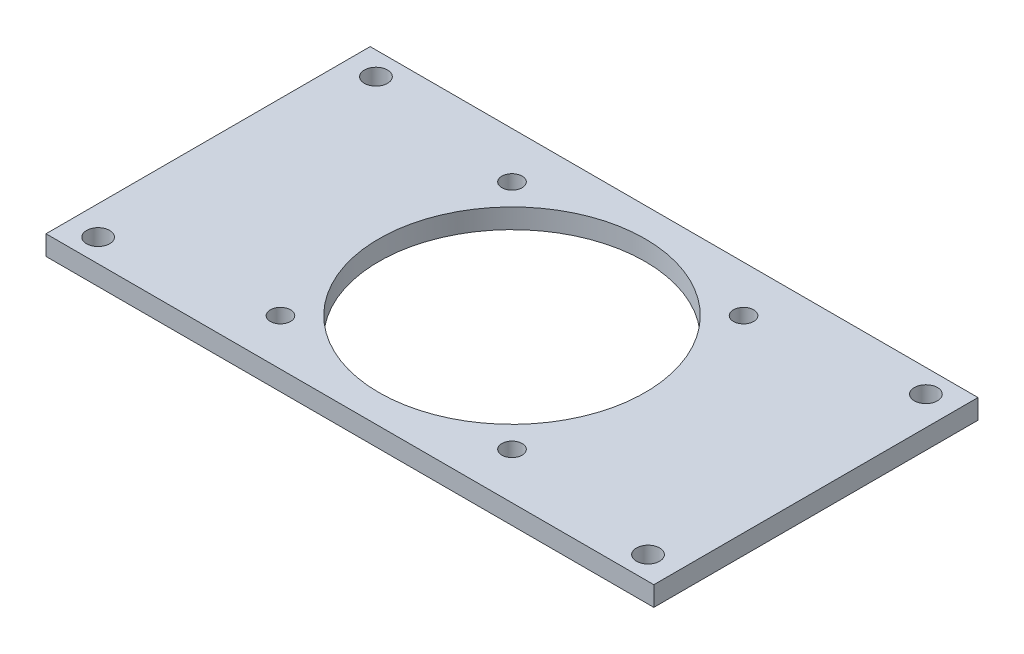
ISO-10303-21;
HEADER;
FILE_DESCRIPTION(('STEP AP214'),'2;1');
FILE_NAME('part.step','',(''),(''),'','','');
FILE_SCHEMA(('AUTOMOTIVE_DESIGN { 1 0 10303 214 1 1 1 1 }'));
ENDSEC;
DATA;
#1=APPLICATION_CONTEXT('core data for automotive mechanical design processes');
#2=APPLICATION_PROTOCOL_DEFINITION('international standard','automotive_design',2000,#1);
#3=PRODUCT_CONTEXT('',#1,'mechanical');
#4=PRODUCT('Part','Part','',(#3));
#5=PRODUCT_RELATED_PRODUCT_CATEGORY('part','',(#4));
#6=PRODUCT_DEFINITION_FORMATION('','',#4);
#7=PRODUCT_DEFINITION_CONTEXT('part definition',#1,'design');
#8=PRODUCT_DEFINITION('design','',#6,#7);
#9=PRODUCT_DEFINITION_SHAPE('','',#8);
#10=(LENGTH_UNIT() NAMED_UNIT(*) SI_UNIT(.MILLI.,.METRE.));
#11=(NAMED_UNIT(*) PLANE_ANGLE_UNIT() SI_UNIT($,.RADIAN.));
#12=(NAMED_UNIT(*) SI_UNIT($,.STERADIAN.) SOLID_ANGLE_UNIT());
#13=UNCERTAINTY_MEASURE_WITH_UNIT(LENGTH_MEASURE(1.E-05),#10,'distance_accuracy_value','');
#14=(GEOMETRIC_REPRESENTATION_CONTEXT(3) GLOBAL_UNCERTAINTY_ASSIGNED_CONTEXT((#13)) GLOBAL_UNIT_ASSIGNED_CONTEXT((#10,
#11,#12)) REPRESENTATION_CONTEXT('',''));
#15=CARTESIAN_POINT('',(0.,0.,0.));
#16=DIRECTION('',(0.,0.,1.));
#17=DIRECTION('',(1.,0.,0.));
#18=AXIS2_PLACEMENT_3D('',#15,#16,#17);
#19=CARTESIAN_POINT('',(0.,4.318,-35.56));
#20=DIRECTION('',(0.,0.,-1.));
#21=DIRECTION('',(-1.,0.,0.));
#22=AXIS2_PLACEMENT_3D('',#19,#20,#21);
#23=PLANE('',#22);
#24=DIRECTION('',(1.,0.,0.));
#25=VECTOR('',#24,1.);
#26=CARTESIAN_POINT('',(0.,0.,-35.56));
#27=LINE('',#26,#25);
#28=CARTESIAN_POINT('',(-66.675,0.,-35.56));
#29=VERTEX_POINT('',#28);
#30=CARTESIAN_POINT('',(66.675,0.,-35.56));
#31=VERTEX_POINT('',#30);
#32=EDGE_CURVE('E128',#29,#31,#27,.T.);
#33=ORIENTED_EDGE('',*,*,#32,.F.);
#34=DIRECTION('',(0.,-1.,0.));
#35=VECTOR('',#34,1.);
#36=CARTESIAN_POINT('',(-66.675,4.318,-35.56));
#37=LINE('',#36,#35);
#38=CARTESIAN_POINT('',(-66.675,4.318,-35.56));
#39=VERTEX_POINT('',#38);
#40=EDGE_CURVE('E11',#39,#29,#37,.T.);
#41=ORIENTED_EDGE('',*,*,#40,.F.);
#42=DIRECTION('',(1.,0.,0.));
#43=VECTOR('',#42,1.);
#44=CARTESIAN_POINT('',(0.,4.318,-35.56));
#45=LINE('',#44,#43);
#46=CARTESIAN_POINT('',(66.675,4.318,-35.56));
#47=VERTEX_POINT('',#46);
#48=EDGE_CURVE('E93',#39,#47,#45,.T.);
#49=ORIENTED_EDGE('',*,*,#48,.T.);
#50=DIRECTION('',(0.,-1.,0.));
#51=VECTOR('',#50,1.);
#52=CARTESIAN_POINT('',(66.675,4.318,-35.56));
#53=LINE('',#52,#51);
#54=EDGE_CURVE('E54',#47,#31,#53,.T.);
#55=ORIENTED_EDGE('',*,*,#54,.T.);
#56=EDGE_LOOP('',(#33,#41,#49,#55));
#57=FACE_BOUND('',#56,.T.);
#58=ADVANCED_FACE('F37',(#57),#23,.T.);
#59=CARTESIAN_POINT('',(-66.675,4.318,0.));
#60=DIRECTION('',(-1.,0.,0.));
#61=DIRECTION('',(0.,0.,1.));
#62=AXIS2_PLACEMENT_3D('',#59,#60,#61);
#63=PLANE('',#62);
#64=DIRECTION('',(0.,0.,-1.));
#65=VECTOR('',#64,1.);
#66=CARTESIAN_POINT('',(-66.675,0.,0.));
#67=LINE('',#66,#65);
#68=CARTESIAN_POINT('',(-66.675,0.,35.56));
#69=VERTEX_POINT('',#68);
#70=EDGE_CURVE('E84',#69,#29,#67,.T.);
#71=ORIENTED_EDGE('',*,*,#70,.F.);
#72=DIRECTION('',(0.,-1.,0.));
#73=VECTOR('',#72,1.);
#74=CARTESIAN_POINT('',(-66.675,4.318,35.56));
#75=LINE('',#74,#73);
#76=CARTESIAN_POINT('',(-66.675,4.318,35.56));
#77=VERTEX_POINT('',#76);
#78=EDGE_CURVE('E46',#77,#69,#75,.T.);
#79=ORIENTED_EDGE('',*,*,#78,.F.);
#80=DIRECTION('',(0.,0.,-1.));
#81=VECTOR('',#80,1.);
#82=CARTESIAN_POINT('',(-66.675,4.318,0.));
#83=LINE('',#82,#81);
#84=EDGE_CURVE('E82',#77,#39,#83,.T.);
#85=ORIENTED_EDGE('',*,*,#84,.T.);
#86=ORIENTED_EDGE('',*,*,#40,.T.);
#87=EDGE_LOOP('',(#71,#79,#85,#86));
#88=FACE_BOUND('',#87,.T.);
#89=ADVANCED_FACE('F81',(#88),#63,.T.);
#90=CARTESIAN_POINT('',(0.,4.318,35.56));
#91=DIRECTION('',(0.,0.,1.));
#92=DIRECTION('',(1.,0.,0.));
#93=AXIS2_PLACEMENT_3D('',#90,#91,#92);
#94=PLANE('',#93);
#95=DIRECTION('',(-1.,0.,0.));
#96=VECTOR('',#95,1.);
#97=CARTESIAN_POINT('',(0.,0.,35.56));
#98=LINE('',#97,#96);
#99=CARTESIAN_POINT('',(66.675,0.,35.56));
#100=VERTEX_POINT('',#99);
#101=EDGE_CURVE('E131',#100,#69,#98,.T.);
#102=ORIENTED_EDGE('',*,*,#101,.F.);
#103=DIRECTION('',(0.,-1.,0.));
#104=VECTOR('',#103,1.);
#105=CARTESIAN_POINT('',(66.675,4.318,35.56));
#106=LINE('',#105,#104);
#107=CARTESIAN_POINT('',(66.675,4.318,35.56));
#108=VERTEX_POINT('',#107);
#109=EDGE_CURVE('E67',#108,#100,#106,.T.);
#110=ORIENTED_EDGE('',*,*,#109,.F.);
#111=DIRECTION('',(-1.,0.,0.));
#112=VECTOR('',#111,1.);
#113=CARTESIAN_POINT('',(0.,4.318,35.56));
#114=LINE('',#113,#112);
#115=EDGE_CURVE('E92',#108,#77,#114,.T.);
#116=ORIENTED_EDGE('',*,*,#115,.T.);
#117=ORIENTED_EDGE('',*,*,#78,.T.);
#118=EDGE_LOOP('',(#102,#110,#116,#117));
#119=FACE_BOUND('',#118,.T.);
#120=ADVANCED_FACE('F95',(#119),#94,.T.);
#121=CARTESIAN_POINT('',(25.4,4.318,25.4));
#122=DIRECTION('',(0.,-1.,0.));
#123=DIRECTION('',(0.,0.,-1.));
#124=AXIS2_PLACEMENT_3D('',#121,#122,#123);
#125=CYLINDRICAL_SURFACE('',#124,2.2225);
#126=CARTESIAN_POINT('',(25.4,4.318,25.4));
#127=DIRECTION('',(0.,1.,0.));
#128=DIRECTION('',(0.,0.,1.));
#129=AXIS2_PLACEMENT_3D('',#126,#127,#128);
#130=CIRCLE('',#129,2.2225);
#131=CARTESIAN_POINT('',(25.4,4.318,27.6225));
#132=VERTEX_POINT('',#131);
#133=EDGE_CURVE('E165',#132,#132,#130,.T.);
#134=ORIENTED_EDGE('',*,*,#133,.T.);
#135=EDGE_LOOP('',(#134));
#136=FACE_BOUND('',#135,.T.);
#137=CARTESIAN_POINT('',(25.4,0.,25.4));
#138=DIRECTION('',(0.,1.,0.));
#139=DIRECTION('',(0.,0.,1.));
#140=AXIS2_PLACEMENT_3D('',#137,#138,#139);
#141=CIRCLE('',#140,2.2225);
#142=CARTESIAN_POINT('',(25.4,0.,27.6225));
#143=VERTEX_POINT('',#142);
#144=EDGE_CURVE('E125',#143,#143,#141,.T.);
#145=ORIENTED_EDGE('',*,*,#144,.F.);
#146=EDGE_LOOP('',(#145));
#147=FACE_BOUND('',#146,.T.);
#148=ADVANCED_FACE('F187',(#136,#147),#125,.F.);
#149=CARTESIAN_POINT('',(25.4,4.318,-25.4));
#150=DIRECTION('',(0.,-1.,0.));
#151=DIRECTION('',(0.,0.,-1.));
#152=AXIS2_PLACEMENT_3D('',#149,#150,#151);
#153=CYLINDRICAL_SURFACE('',#152,2.2225);
#154=CARTESIAN_POINT('',(25.4,4.318,-25.4));
#155=DIRECTION('',(0.,1.,0.));
#156=DIRECTION('',(0.,0.,1.));
#157=AXIS2_PLACEMENT_3D('',#154,#155,#156);
#158=CIRCLE('',#157,2.2225);
#159=CARTESIAN_POINT('',(25.4,4.318,-23.1775));
#160=VERTEX_POINT('',#159);
#161=EDGE_CURVE('E162',#160,#160,#158,.T.);
#162=ORIENTED_EDGE('',*,*,#161,.T.);
#163=EDGE_LOOP('',(#162));
#164=FACE_BOUND('',#163,.T.);
#165=CARTESIAN_POINT('',(25.4,0.,-25.4));
#166=DIRECTION('',(0.,1.,0.));
#167=DIRECTION('',(0.,0.,1.));
#168=AXIS2_PLACEMENT_3D('',#165,#166,#167);
#169=CIRCLE('',#168,2.2225);
#170=CARTESIAN_POINT('',(25.4,0.,-23.1775));
#171=VERTEX_POINT('',#170);
#172=EDGE_CURVE('E122',#171,#171,#169,.T.);
#173=ORIENTED_EDGE('',*,*,#172,.F.);
#174=EDGE_LOOP('',(#173));
#175=FACE_BOUND('',#174,.T.);
#176=ADVANCED_FACE('F190',(#164,#175),#153,.F.);
#177=CARTESIAN_POINT('',(-25.4,4.318,-25.4));
#178=DIRECTION('',(0.,-1.,0.));
#179=DIRECTION('',(0.,0.,-1.));
#180=AXIS2_PLACEMENT_3D('',#177,#178,#179);
#181=CYLINDRICAL_SURFACE('',#180,2.2225);
#182=CARTESIAN_POINT('',(-25.4,4.318,-25.4));
#183=DIRECTION('',(0.,1.,0.));
#184=DIRECTION('',(0.,0.,1.));
#185=AXIS2_PLACEMENT_3D('',#182,#183,#184);
#186=CIRCLE('',#185,2.2225);
#187=CARTESIAN_POINT('',(-25.4,4.318,-23.1775));
#188=VERTEX_POINT('',#187);
#189=EDGE_CURVE('E159',#188,#188,#186,.T.);
#190=ORIENTED_EDGE('',*,*,#189,.T.);
#191=EDGE_LOOP('',(#190));
#192=FACE_BOUND('',#191,.T.);
#193=CARTESIAN_POINT('',(-25.4,0.,-25.4));
#194=DIRECTION('',(0.,1.,0.));
#195=DIRECTION('',(0.,0.,1.));
#196=AXIS2_PLACEMENT_3D('',#193,#194,#195);
#197=CIRCLE('',#196,2.2225);
#198=CARTESIAN_POINT('',(-25.4,0.,-23.1775));
#199=VERTEX_POINT('',#198);
#200=EDGE_CURVE('E119',#199,#199,#197,.T.);
#201=ORIENTED_EDGE('',*,*,#200,.F.);
#202=EDGE_LOOP('',(#201));
#203=FACE_BOUND('',#202,.T.);
#204=ADVANCED_FACE('F194',(#192,#203),#181,.F.);
#205=CARTESIAN_POINT('',(-25.4,4.318,25.4));
#206=DIRECTION('',(0.,-1.,0.));
#207=DIRECTION('',(0.,0.,-1.));
#208=AXIS2_PLACEMENT_3D('',#205,#206,#207);
#209=CYLINDRICAL_SURFACE('',#208,2.2225);
#210=CARTESIAN_POINT('',(-25.4,4.318,25.4));
#211=DIRECTION('',(0.,1.,0.));
#212=DIRECTION('',(0.,0.,1.));
#213=AXIS2_PLACEMENT_3D('',#210,#211,#212);
#214=CIRCLE('',#213,2.2225);
#215=CARTESIAN_POINT('',(-25.4,4.318,27.6225));
#216=VERTEX_POINT('',#215);
#217=EDGE_CURVE('E156',#216,#216,#214,.T.);
#218=ORIENTED_EDGE('',*,*,#217,.T.);
#219=EDGE_LOOP('',(#218));
#220=FACE_BOUND('',#219,.T.);
#221=CARTESIAN_POINT('',(-25.4,0.,25.4));
#222=DIRECTION('',(0.,1.,0.));
#223=DIRECTION('',(0.,0.,1.));
#224=AXIS2_PLACEMENT_3D('',#221,#222,#223);
#225=CIRCLE('',#224,2.2225);
#226=CARTESIAN_POINT('',(-25.4,0.,27.6225));
#227=VERTEX_POINT('',#226);
#228=EDGE_CURVE('E116',#227,#227,#225,.T.);
#229=ORIENTED_EDGE('',*,*,#228,.F.);
#230=EDGE_LOOP('',(#229));
#231=FACE_BOUND('',#230,.T.);
#232=ADVANCED_FACE('F198',(#220,#231),#209,.F.);
#233=CARTESIAN_POINT('',(0.,4.318,0.));
#234=DIRECTION('',(0.,-1.,0.));
#235=DIRECTION('',(0.,0.,-1.));
#236=AXIS2_PLACEMENT_3D('',#233,#234,#235);
#237=CYLINDRICAL_SURFACE('',#236,29.21);
#238=CARTESIAN_POINT('',(0.,4.318,0.));
#239=DIRECTION('',(0.,1.,0.));
#240=DIRECTION('',(0.,0.,1.));
#241=AXIS2_PLACEMENT_3D('',#238,#239,#240);
#242=CIRCLE('',#241,29.21);
#243=CARTESIAN_POINT('',(0.,4.318,29.21));
#244=VERTEX_POINT('',#243);
#245=EDGE_CURVE('E153',#244,#244,#242,.T.);
#246=ORIENTED_EDGE('',*,*,#245,.T.);
#247=EDGE_LOOP('',(#246));
#248=FACE_BOUND('',#247,.T.);
#249=CARTESIAN_POINT('',(0.,0.,0.));
#250=DIRECTION('',(0.,1.,0.));
#251=DIRECTION('',(0.,0.,1.));
#252=AXIS2_PLACEMENT_3D('',#249,#250,#251);
#253=CIRCLE('',#252,29.21);
#254=CARTESIAN_POINT('',(0.,0.,29.21));
#255=VERTEX_POINT('',#254);
#256=EDGE_CURVE('E113',#255,#255,#253,.T.);
#257=ORIENTED_EDGE('',*,*,#256,.F.);
#258=EDGE_LOOP('',(#257));
#259=FACE_BOUND('',#258,.T.);
#260=ADVANCED_FACE('F202',(#248,#259),#237,.F.);
#261=CARTESIAN_POINT('',(60.325,4.318,-30.48));
#262=DIRECTION('',(0.,-1.,0.));
#263=DIRECTION('',(0.,0.,-1.));
#264=AXIS2_PLACEMENT_3D('',#261,#262,#263);
#265=CYLINDRICAL_SURFACE('',#264,2.53999999999999);
#266=CARTESIAN_POINT('',(60.325,4.318,-30.48));
#267=DIRECTION('',(0.,1.,0.));
#268=DIRECTION('',(0.,0.,1.));
#269=AXIS2_PLACEMENT_3D('',#266,#267,#268);
#270=CIRCLE('',#269,2.53999999999999);
#271=CARTESIAN_POINT('',(60.325,4.318,-27.94));
#272=VERTEX_POINT('',#271);
#273=EDGE_CURVE('E150',#272,#272,#270,.T.);
#274=ORIENTED_EDGE('',*,*,#273,.T.);
#275=EDGE_LOOP('',(#274));
#276=FACE_BOUND('',#275,.T.);
#277=CARTESIAN_POINT('',(60.325,0.,-30.48));
#278=DIRECTION('',(0.,1.,0.));
#279=DIRECTION('',(0.,0.,1.));
#280=AXIS2_PLACEMENT_3D('',#277,#278,#279);
#281=CIRCLE('',#280,2.53999999999999);
#282=CARTESIAN_POINT('',(60.325,0.,-27.94));
#283=VERTEX_POINT('',#282);
#284=EDGE_CURVE('E110',#283,#283,#281,.T.);
#285=ORIENTED_EDGE('',*,*,#284,.F.);
#286=EDGE_LOOP('',(#285));
#287=FACE_BOUND('',#286,.T.);
#288=ADVANCED_FACE('F206',(#276,#287),#265,.F.);
#289=CARTESIAN_POINT('',(-60.325,4.318,-30.48));
#290=DIRECTION('',(0.,-1.,0.));
#291=DIRECTION('',(0.,0.,-1.));
#292=AXIS2_PLACEMENT_3D('',#289,#290,#291);
#293=CYLINDRICAL_SURFACE('',#292,2.54);
#294=CARTESIAN_POINT('',(-60.325,4.318,-30.48));
#295=DIRECTION('',(0.,1.,0.));
#296=DIRECTION('',(0.,0.,1.));
#297=AXIS2_PLACEMENT_3D('',#294,#295,#296);
#298=CIRCLE('',#297,2.54);
#299=CARTESIAN_POINT('',(-60.325,4.318,-27.94));
#300=VERTEX_POINT('',#299);
#301=EDGE_CURVE('E145',#300,#300,#298,.T.);
#302=ORIENTED_EDGE('',*,*,#301,.T.);
#303=EDGE_LOOP('',(#302));
#304=FACE_BOUND('',#303,.T.);
#305=CARTESIAN_POINT('',(-60.325,0.,-30.48));
#306=DIRECTION('',(0.,1.,0.));
#307=DIRECTION('',(0.,0.,1.));
#308=AXIS2_PLACEMENT_3D('',#305,#306,#307);
#309=CIRCLE('',#308,2.54);
#310=CARTESIAN_POINT('',(-60.325,0.,-27.94));
#311=VERTEX_POINT('',#310);
#312=EDGE_CURVE('E107',#311,#311,#309,.T.);
#313=ORIENTED_EDGE('',*,*,#312,.F.);
#314=EDGE_LOOP('',(#313));
#315=FACE_BOUND('',#314,.T.);
#316=ADVANCED_FACE('F210',(#304,#315),#293,.F.);
#317=CARTESIAN_POINT('',(-60.325,4.318,30.48));
#318=DIRECTION('',(0.,-1.,0.));
#319=DIRECTION('',(0.,0.,-1.));
#320=AXIS2_PLACEMENT_3D('',#317,#318,#319);
#321=CYLINDRICAL_SURFACE('',#320,2.54);
#322=CARTESIAN_POINT('',(-60.325,4.318,30.48));
#323=DIRECTION('',(0.,1.,0.));
#324=DIRECTION('',(0.,0.,1.));
#325=AXIS2_PLACEMENT_3D('',#322,#323,#324);
#326=CIRCLE('',#325,2.54);
#327=CARTESIAN_POINT('',(-60.325,4.318,33.02));
#328=VERTEX_POINT('',#327);
#329=EDGE_CURVE('E140',#328,#328,#326,.T.);
#330=ORIENTED_EDGE('',*,*,#329,.T.);
#331=EDGE_LOOP('',(#330));
#332=FACE_BOUND('',#331,.T.);
#333=CARTESIAN_POINT('',(-60.325,0.,30.48));
#334=DIRECTION('',(0.,1.,0.));
#335=DIRECTION('',(0.,0.,1.));
#336=AXIS2_PLACEMENT_3D('',#333,#334,#335);
#337=CIRCLE('',#336,2.54);
#338=CARTESIAN_POINT('',(-60.325,0.,33.02));
#339=VERTEX_POINT('',#338);
#340=EDGE_CURVE('E104',#339,#339,#337,.T.);
#341=ORIENTED_EDGE('',*,*,#340,.F.);
#342=EDGE_LOOP('',(#341));
#343=FACE_BOUND('',#342,.T.);
#344=ADVANCED_FACE('F177',(#332,#343),#321,.F.);
#345=CARTESIAN_POINT('',(60.325,4.318,30.48));
#346=DIRECTION('',(0.,-1.,0.));
#347=DIRECTION('',(0.,0.,-1.));
#348=AXIS2_PLACEMENT_3D('',#345,#346,#347);
#349=CYLINDRICAL_SURFACE('',#348,2.54);
#350=CARTESIAN_POINT('',(60.325,4.318,30.48));
#351=DIRECTION('',(0.,1.,0.));
#352=DIRECTION('',(0.,0.,1.));
#353=AXIS2_PLACEMENT_3D('',#350,#351,#352);
#354=CIRCLE('',#353,2.54);
#355=CARTESIAN_POINT('',(60.325,4.318,33.02));
#356=VERTEX_POINT('',#355);
#357=EDGE_CURVE('E136',#356,#356,#354,.T.);
#358=ORIENTED_EDGE('',*,*,#357,.T.);
#359=EDGE_LOOP('',(#358));
#360=FACE_BOUND('',#359,.T.);
#361=CARTESIAN_POINT('',(60.325,0.,30.48));
#362=DIRECTION('',(0.,1.,0.));
#363=DIRECTION('',(0.,0.,1.));
#364=AXIS2_PLACEMENT_3D('',#361,#362,#363);
#365=CIRCLE('',#364,2.54);
#366=CARTESIAN_POINT('',(60.325,0.,33.02));
#367=VERTEX_POINT('',#366);
#368=EDGE_CURVE('E101',#367,#367,#365,.T.);
#369=ORIENTED_EDGE('',*,*,#368,.F.);
#370=EDGE_LOOP('',(#369));
#371=FACE_BOUND('',#370,.T.);
#372=ADVANCED_FACE('F39',(#360,#371),#349,.F.);
#373=CARTESIAN_POINT('',(66.675,4.318,0.));
#374=DIRECTION('',(1.,0.,0.));
#375=DIRECTION('',(0.,0.,-1.));
#376=AXIS2_PLACEMENT_3D('',#373,#374,#375);
#377=PLANE('',#376);
#378=DIRECTION('',(0.,0.,1.));
#379=VECTOR('',#378,1.);
#380=CARTESIAN_POINT('',(66.675,0.,0.));
#381=LINE('',#380,#379);
#382=EDGE_CURVE('E133',#31,#100,#381,.T.);
#383=ORIENTED_EDGE('',*,*,#382,.F.);
#384=ORIENTED_EDGE('',*,*,#54,.F.);
#385=DIRECTION('',(0.,0.,1.));
#386=VECTOR('',#385,1.);
#387=CARTESIAN_POINT('',(66.675,4.318,0.));
#388=LINE('',#387,#386);
#389=EDGE_CURVE('E96',#47,#108,#388,.T.);
#390=ORIENTED_EDGE('',*,*,#389,.T.);
#391=ORIENTED_EDGE('',*,*,#109,.T.);
#392=EDGE_LOOP('',(#383,#384,#390,#391));
#393=FACE_BOUND('',#392,.T.);
#394=ADVANCED_FACE('F167',(#393),#377,.T.);
#395=CARTESIAN_POINT('',(0.,4.318,0.));
#396=DIRECTION('',(0.,1.,0.));
#397=DIRECTION('',(0.,0.,1.));
#398=AXIS2_PLACEMENT_3D('',#395,#396,#397);
#399=PLANE('',#398);
#400=ORIENTED_EDGE('',*,*,#357,.F.);
#401=EDGE_LOOP('',(#400));
#402=FACE_BOUND('',#401,.T.);
#403=ORIENTED_EDGE('',*,*,#329,.F.);
#404=EDGE_LOOP('',(#403));
#405=FACE_BOUND('',#404,.T.);
#406=ORIENTED_EDGE('',*,*,#301,.F.);
#407=EDGE_LOOP('',(#406));
#408=FACE_BOUND('',#407,.T.);
#409=ORIENTED_EDGE('',*,*,#273,.F.);
#410=EDGE_LOOP('',(#409));
#411=FACE_BOUND('',#410,.T.);
#412=ORIENTED_EDGE('',*,*,#245,.F.);
#413=EDGE_LOOP('',(#412));
#414=FACE_BOUND('',#413,.T.);
#415=ORIENTED_EDGE('',*,*,#217,.F.);
#416=EDGE_LOOP('',(#415));
#417=FACE_BOUND('',#416,.T.);
#418=ORIENTED_EDGE('',*,*,#189,.F.);
#419=EDGE_LOOP('',(#418));
#420=FACE_BOUND('',#419,.T.);
#421=ORIENTED_EDGE('',*,*,#161,.F.);
#422=EDGE_LOOP('',(#421));
#423=FACE_BOUND('',#422,.T.);
#424=ORIENTED_EDGE('',*,*,#133,.F.);
#425=EDGE_LOOP('',(#424));
#426=FACE_BOUND('',#425,.T.);
#427=ORIENTED_EDGE('',*,*,#48,.F.);
#428=ORIENTED_EDGE('',*,*,#84,.F.);
#429=ORIENTED_EDGE('',*,*,#115,.F.);
#430=ORIENTED_EDGE('',*,*,#389,.F.);
#431=EDGE_LOOP('',(#427,#428,#429,#430));
#432=FACE_BOUND('',#431,.T.);
#433=ADVANCED_FACE('F90',(#402,#405,#408,#411,#414,#417,#420,#423,#426,#432),#399,.T.);
#434=CARTESIAN_POINT('',(0.,0.,0.));
#435=DIRECTION('',(0.,1.,0.));
#436=DIRECTION('',(0.,0.,1.));
#437=AXIS2_PLACEMENT_3D('',#434,#435,#436);
#438=PLANE('',#437);
#439=ORIENTED_EDGE('',*,*,#368,.T.);
#440=EDGE_LOOP('',(#439));
#441=FACE_BOUND('',#440,.T.);
#442=ORIENTED_EDGE('',*,*,#340,.T.);
#443=EDGE_LOOP('',(#442));
#444=FACE_BOUND('',#443,.T.);
#445=ORIENTED_EDGE('',*,*,#312,.T.);
#446=EDGE_LOOP('',(#445));
#447=FACE_BOUND('',#446,.T.);
#448=ORIENTED_EDGE('',*,*,#284,.T.);
#449=EDGE_LOOP('',(#448));
#450=FACE_BOUND('',#449,.T.);
#451=ORIENTED_EDGE('',*,*,#256,.T.);
#452=EDGE_LOOP('',(#451));
#453=FACE_BOUND('',#452,.T.);
#454=ORIENTED_EDGE('',*,*,#228,.T.);
#455=EDGE_LOOP('',(#454));
#456=FACE_BOUND('',#455,.T.);
#457=ORIENTED_EDGE('',*,*,#200,.T.);
#458=EDGE_LOOP('',(#457));
#459=FACE_BOUND('',#458,.T.);
#460=ORIENTED_EDGE('',*,*,#172,.T.);
#461=EDGE_LOOP('',(#460));
#462=FACE_BOUND('',#461,.T.);
#463=ORIENTED_EDGE('',*,*,#144,.T.);
#464=EDGE_LOOP('',(#463));
#465=FACE_BOUND('',#464,.T.);
#466=ORIENTED_EDGE('',*,*,#32,.T.);
#467=ORIENTED_EDGE('',*,*,#382,.T.);
#468=ORIENTED_EDGE('',*,*,#101,.T.);
#469=ORIENTED_EDGE('',*,*,#70,.T.);
#470=EDGE_LOOP('',(#466,#467,#468,#469));
#471=FACE_BOUND('',#470,.T.);
#472=ADVANCED_FACE('F174',(#441,#444,#447,#450,#453,#456,#459,#462,#465,#471),#438,.F.);
#473=CLOSED_SHELL('',(#58,#89,#120,#148,#176,#204,#232,#260,#288,#316,#344,#372,#394,#433,#472));
#474=MANIFOLD_SOLID_BREP('B2',#473);
#475=ADVANCED_BREP_SHAPE_REPRESENTATION('',(#18,#474),#14);
#476=SHAPE_DEFINITION_REPRESENTATION(#9,#475);
ENDSEC;
END-ISO-10303-21;
